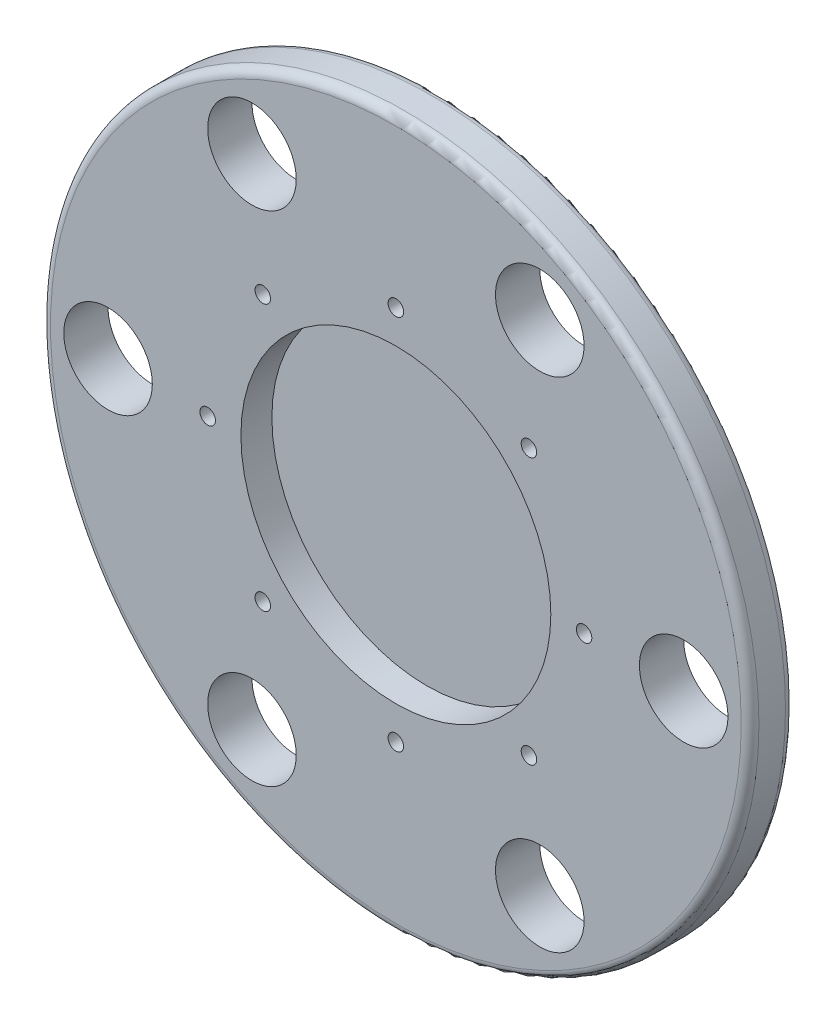
ISO-10303-21;
HEADER;
FILE_DESCRIPTION(('STEP AP214'),'2;1');
FILE_NAME('part.step','',(''),(''),'','','');
FILE_SCHEMA(('AUTOMOTIVE_DESIGN { 1 0 10303 214 1 1 1 1 }'));
ENDSEC;
DATA;
#1=APPLICATION_CONTEXT('core data for automotive mechanical design processes');
#2=APPLICATION_PROTOCOL_DEFINITION('international standard','automotive_design',2000,#1);
#3=PRODUCT_CONTEXT('',#1,'mechanical');
#4=PRODUCT('Part','Part','',(#3));
#5=PRODUCT_RELATED_PRODUCT_CATEGORY('part','',(#4));
#6=PRODUCT_DEFINITION_FORMATION('','',#4);
#7=PRODUCT_DEFINITION_CONTEXT('part definition',#1,'design');
#8=PRODUCT_DEFINITION('design','',#6,#7);
#9=PRODUCT_DEFINITION_SHAPE('','',#8);
#10=(LENGTH_UNIT() NAMED_UNIT(*) SI_UNIT(.MILLI.,.METRE.));
#11=(NAMED_UNIT(*) PLANE_ANGLE_UNIT() SI_UNIT($,.RADIAN.));
#12=(NAMED_UNIT(*) SI_UNIT($,.STERADIAN.) SOLID_ANGLE_UNIT());
#13=UNCERTAINTY_MEASURE_WITH_UNIT(LENGTH_MEASURE(1.E-05),#10,'distance_accuracy_value','');
#14=(GEOMETRIC_REPRESENTATION_CONTEXT(3) GLOBAL_UNCERTAINTY_ASSIGNED_CONTEXT((#13)) GLOBAL_UNIT_ASSIGNED_CONTEXT((#10,
#11,#12)) REPRESENTATION_CONTEXT('',''));
#15=CARTESIAN_POINT('',(0.,0.,0.));
#16=DIRECTION('',(0.,0.,1.));
#17=DIRECTION('',(1.,0.,0.));
#18=AXIS2_PLACEMENT_3D('',#15,#16,#17);
#19=CARTESIAN_POINT('',(0.,0.,-10.));
#20=DIRECTION('',(0.,0.,1.));
#21=DIRECTION('',(1.,0.,0.));
#22=AXIS2_PLACEMENT_3D('',#19,#20,#21);
#23=CYLINDRICAL_SURFACE('',#22,80.);
#24=CARTESIAN_POINT('',(0.,0.,-8.));
#25=DIRECTION('',(0.,0.,1.));
#26=DIRECTION('',(1.,0.,0.));
#27=AXIS2_PLACEMENT_3D('',#24,#25,#26);
#28=CIRCLE('',#27,80.);
#29=CARTESIAN_POINT('',(80.,0.,-8.));
#30=VERTEX_POINT('',#29);
#31=EDGE_CURVE('E53',#30,#30,#28,.T.);
#32=ORIENTED_EDGE('',*,*,#31,.T.);
#33=EDGE_LOOP('',(#32));
#34=FACE_BOUND('',#33,.T.);
#35=CARTESIAN_POINT('',(0.,0.,-2.));
#36=DIRECTION('',(0.,0.,1.));
#37=DIRECTION('',(1.,0.,0.));
#38=AXIS2_PLACEMENT_3D('',#35,#36,#37);
#39=CIRCLE('',#38,80.);
#40=CARTESIAN_POINT('',(80.,0.,-2.));
#41=VERTEX_POINT('',#40);
#42=EDGE_CURVE('E58',#41,#41,#39,.F.);
#43=ORIENTED_EDGE('',*,*,#42,.T.);
#44=EDGE_LOOP('',(#43));
#45=FACE_BOUND('',#44,.T.);
#46=ADVANCED_FACE('F40',(#34,#45),#23,.T.);
#47=CARTESIAN_POINT('',(0.,0.,-10.));
#48=DIRECTION('',(0.,0.,1.));
#49=DIRECTION('',(1.,0.,0.));
#50=AXIS2_PLACEMENT_3D('',#47,#48,#49);
#51=PLANE('',#50);
#52=CARTESIAN_POINT('',(0.,0.,-10.));
#53=DIRECTION('',(0.,0.,1.));
#54=DIRECTION('',(1.,0.,0.));
#55=AXIS2_PLACEMENT_3D('',#52,#53,#54);
#56=CIRCLE('',#55,78.);
#57=CARTESIAN_POINT('',(78.,0.,-10.));
#58=VERTEX_POINT('',#57);
#59=EDGE_CURVE('E48',#58,#58,#56,.F.);
#60=ORIENTED_EDGE('',*,*,#59,.T.);
#61=EDGE_LOOP('',(#60));
#62=FACE_BOUND('',#61,.T.);
#63=CARTESIAN_POINT('',(-42.5,0.,-10.));
#64=DIRECTION('',(0.,0.,1.));
#65=DIRECTION('',(1.,0.,0.));
#66=AXIS2_PLACEMENT_3D('',#63,#64,#65);
#67=CIRCLE('',#66,1.75);
#68=CARTESIAN_POINT('',(-40.75,0.,-10.));
#69=VERTEX_POINT('',#68);
#70=EDGE_CURVE('E111',#69,#69,#67,.T.);
#71=ORIENTED_EDGE('',*,*,#70,.T.);
#72=EDGE_LOOP('',(#71));
#73=FACE_BOUND('',#72,.T.);
#74=CARTESIAN_POINT('',(-30.0520382004282,30.0520382004283,-10.));
#75=DIRECTION('',(0.,0.,1.));
#76=DIRECTION('',(1.,0.,0.));
#77=AXIS2_PLACEMENT_3D('',#74,#75,#76);
#78=CIRCLE('',#77,1.75);
#79=CARTESIAN_POINT('',(-28.3020382004282,30.0520382004283,-10.));
#80=VERTEX_POINT('',#79);
#81=EDGE_CURVE('E169',#80,#80,#78,.T.);
#82=ORIENTED_EDGE('',*,*,#81,.T.);
#83=EDGE_LOOP('',(#82));
#84=FACE_BOUND('',#83,.T.);
#85=CARTESIAN_POINT('',(1.48387956900833E-13,42.5,-10.));
#86=DIRECTION('',(0.,0.,1.));
#87=DIRECTION('',(1.,0.,0.));
#88=AXIS2_PLACEMENT_3D('',#85,#86,#87);
#89=CIRCLE('',#88,1.75);
#90=CARTESIAN_POINT('',(1.75000000000015,42.5,-10.));
#91=VERTEX_POINT('',#90);
#92=EDGE_CURVE('E161',#91,#91,#89,.T.);
#93=ORIENTED_EDGE('',*,*,#92,.T.);
#94=EDGE_LOOP('',(#93));
#95=FACE_BOUND('',#94,.T.);
#96=CARTESIAN_POINT('',(30.0520382004284,30.0520382004281,-10.));
#97=DIRECTION('',(0.,0.,1.));
#98=DIRECTION('',(1.,0.,0.));
#99=AXIS2_PLACEMENT_3D('',#96,#97,#98);
#100=CIRCLE('',#99,1.75);
#101=CARTESIAN_POINT('',(31.8020382004284,30.0520382004281,-10.));
#102=VERTEX_POINT('',#101);
#103=EDGE_CURVE('E153',#102,#102,#100,.T.);
#104=ORIENTED_EDGE('',*,*,#103,.T.);
#105=EDGE_LOOP('',(#104));
#106=FACE_BOUND('',#105,.T.);
#107=CARTESIAN_POINT('',(42.5,-2.96775913801666E-13,-10.));
#108=DIRECTION('',(0.,0.,1.));
#109=DIRECTION('',(1.,0.,0.));
#110=AXIS2_PLACEMENT_3D('',#107,#108,#109);
#111=CIRCLE('',#110,1.75000000000001);
#112=CARTESIAN_POINT('',(44.25,-2.96775913801666E-13,-10.));
#113=VERTEX_POINT('',#112);
#114=EDGE_CURVE('E145',#113,#113,#111,.T.);
#115=ORIENTED_EDGE('',*,*,#114,.T.);
#116=EDGE_LOOP('',(#115));
#117=FACE_BOUND('',#116,.T.);
#118=CARTESIAN_POINT('',(30.052038200428,-30.0520382004285,-10.));
#119=DIRECTION('',(0.,0.,1.));
#120=DIRECTION('',(1.,0.,0.));
#121=AXIS2_PLACEMENT_3D('',#118,#119,#120);
#122=CIRCLE('',#121,1.75);
#123=CARTESIAN_POINT('',(31.802038200428,-30.0520382004285,-10.));
#124=VERTEX_POINT('',#123);
#125=EDGE_CURVE('E137',#124,#124,#122,.T.);
#126=ORIENTED_EDGE('',*,*,#125,.T.);
#127=EDGE_LOOP('',(#126));
#128=FACE_BOUND('',#127,.T.);
#129=CARTESIAN_POINT('',(-4.451638707025E-13,-42.5,-10.));
#130=DIRECTION('',(0.,0.,1.));
#131=DIRECTION('',(1.,0.,0.));
#132=AXIS2_PLACEMENT_3D('',#129,#130,#131);
#133=CIRCLE('',#132,1.75000000000001);
#134=CARTESIAN_POINT('',(1.74999999999956,-42.5,-10.));
#135=VERTEX_POINT('',#134);
#136=EDGE_CURVE('E129',#135,#135,#133,.T.);
#137=ORIENTED_EDGE('',*,*,#136,.T.);
#138=EDGE_LOOP('',(#137));
#139=FACE_BOUND('',#138,.T.);
#140=CARTESIAN_POINT('',(-30.0520382004286,-30.0520382004279,-10.));
#141=DIRECTION('',(0.,0.,1.));
#142=DIRECTION('',(1.,0.,0.));
#143=AXIS2_PLACEMENT_3D('',#140,#141,#142);
#144=CIRCLE('',#143,1.75);
#145=CARTESIAN_POINT('',(-28.3020382004286,-30.0520382004279,-10.));
#146=VERTEX_POINT('',#145);
#147=EDGE_CURVE('E121',#146,#146,#144,.T.);
#148=ORIENTED_EDGE('',*,*,#147,.T.);
#149=EDGE_LOOP('',(#148));
#150=FACE_BOUND('',#149,.T.);
#151=CARTESIAN_POINT('',(-65.,0.,-10.));
#152=DIRECTION('',(0.,0.,1.));
#153=DIRECTION('',(1.,0.,0.));
#154=AXIS2_PLACEMENT_3D('',#151,#152,#153);
#155=CIRCLE('',#154,10.);
#156=CARTESIAN_POINT('',(-55.,0.,-10.));
#157=VERTEX_POINT('',#156);
#158=EDGE_CURVE('E69',#157,#157,#155,.T.);
#159=ORIENTED_EDGE('',*,*,#158,.T.);
#160=EDGE_LOOP('',(#159));
#161=FACE_BOUND('',#160,.T.);
#162=CARTESIAN_POINT('',(-32.4995000000007,-56.2925172713919,-10.));
#163=DIRECTION('',(0.,0.,1.));
#164=DIRECTION('',(1.,0.,0.));
#165=AXIS2_PLACEMENT_3D('',#162,#163,#164);
#166=CIRCLE('',#165,10.);
#167=CARTESIAN_POINT('',(-22.4995000000007,-56.2925172713919,-10.));
#168=VERTEX_POINT('',#167);
#169=EDGE_CURVE('E107',#168,#168,#166,.T.);
#170=ORIENTED_EDGE('',*,*,#169,.T.);
#171=EDGE_LOOP('',(#170));
#172=FACE_BOUND('',#171,.T.);
#173=CARTESIAN_POINT('',(32.5014999999995,-56.2925172713926,-10.));
#174=DIRECTION('',(0.,0.,1.));
#175=DIRECTION('',(1.,0.,0.));
#176=AXIS2_PLACEMENT_3D('',#173,#174,#175);
#177=CIRCLE('',#176,10.);
#178=CARTESIAN_POINT('',(42.5014999999995,-56.2925172713926,-10.));
#179=VERTEX_POINT('',#178);
#180=EDGE_CURVE('E73',#179,#179,#177,.T.);
#181=ORIENTED_EDGE('',*,*,#180,.T.);
#182=EDGE_LOOP('',(#181));
#183=FACE_BOUND('',#182,.T.);
#184=CARTESIAN_POINT('',(65.002,-4.53899557012285E-13,-10.));
#185=DIRECTION('',(0.,0.,1.));
#186=DIRECTION('',(1.,0.,0.));
#187=AXIS2_PLACEMENT_3D('',#184,#185,#186);
#188=CIRCLE('',#187,10.);
#189=CARTESIAN_POINT('',(75.002,-4.53899557012285E-13,-10.));
#190=VERTEX_POINT('',#189);
#191=EDGE_CURVE('E82',#190,#190,#188,.T.);
#192=ORIENTED_EDGE('',*,*,#191,.T.);
#193=EDGE_LOOP('',(#192));
#194=FACE_BOUND('',#193,.T.);
#195=CARTESIAN_POINT('',(32.5015000000003,56.2925172713922,-10.));
#196=DIRECTION('',(0.,0.,1.));
#197=DIRECTION('',(1.,0.,0.));
#198=AXIS2_PLACEMENT_3D('',#195,#196,#197);
#199=CIRCLE('',#198,10.);
#200=CARTESIAN_POINT('',(42.5015000000003,56.2925172713922,-10.));
#201=VERTEX_POINT('',#200);
#202=EDGE_CURVE('E90',#201,#201,#199,.T.);
#203=ORIENTED_EDGE('',*,*,#202,.T.);
#204=EDGE_LOOP('',(#203));
#205=FACE_BOUND('',#204,.T.);
#206=CARTESIAN_POINT('',(-32.4994999999999,56.2925172713924,-10.));
#207=DIRECTION('',(0.,0.,1.));
#208=DIRECTION('',(1.,0.,0.));
#209=AXIS2_PLACEMENT_3D('',#206,#207,#208);
#210=CIRCLE('',#209,10.);
#211=CARTESIAN_POINT('',(-22.4994999999999,56.2925172713924,-10.));
#212=VERTEX_POINT('',#211);
#213=EDGE_CURVE('E98',#212,#212,#210,.T.);
#214=ORIENTED_EDGE('',*,*,#213,.T.);
#215=EDGE_LOOP('',(#214));
#216=FACE_BOUND('',#215,.T.);
#217=ADVANCED_FACE('F185',(#62,#73,#84,#95,#106,#117,#128,#139,#150,#161,#172,#183,#194,#205,
#216),#51,.F.);
#218=CARTESIAN_POINT('',(0.,0.,0.));
#219=DIRECTION('',(0.,0.,1.));
#220=DIRECTION('',(1.,0.,0.));
#221=AXIS2_PLACEMENT_3D('',#218,#219,#220);
#222=PLANE('',#221);
#223=CARTESIAN_POINT('',(0.,0.,0.));
#224=DIRECTION('',(0.,0.,1.));
#225=DIRECTION('',(1.,0.,0.));
#226=AXIS2_PLACEMENT_3D('',#223,#224,#225);
#227=CIRCLE('',#226,78.);
#228=CARTESIAN_POINT('',(78.,0.,0.));
#229=VERTEX_POINT('',#228);
#230=EDGE_CURVE('E10',#229,#229,#227,.T.);
#231=ORIENTED_EDGE('',*,*,#230,.T.);
#232=EDGE_LOOP('',(#231));
#233=FACE_BOUND('',#232,.T.);
#234=CARTESIAN_POINT('',(-42.5,0.,0.));
#235=DIRECTION('',(0.,0.,1.));
#236=DIRECTION('',(1.,0.,0.));
#237=AXIS2_PLACEMENT_3D('',#234,#235,#236);
#238=CIRCLE('',#237,1.75);
#239=CARTESIAN_POINT('',(-40.75,0.,0.));
#240=VERTEX_POINT('',#239);
#241=EDGE_CURVE('E177',#240,#240,#238,.T.);
#242=ORIENTED_EDGE('',*,*,#241,.F.);
#243=EDGE_LOOP('',(#242));
#244=FACE_BOUND('',#243,.T.);
#245=CARTESIAN_POINT('',(-30.0520382004282,30.0520382004283,0.));
#246=DIRECTION('',(0.,0.,1.));
#247=DIRECTION('',(1.,0.,0.));
#248=AXIS2_PLACEMENT_3D('',#245,#246,#247);
#249=CIRCLE('',#248,1.75);
#250=CARTESIAN_POINT('',(-28.3020382004282,30.0520382004283,0.));
#251=VERTEX_POINT('',#250);
#252=EDGE_CURVE('E173',#251,#251,#249,.T.);
#253=ORIENTED_EDGE('',*,*,#252,.F.);
#254=EDGE_LOOP('',(#253));
#255=FACE_BOUND('',#254,.T.);
#256=CARTESIAN_POINT('',(1.48387956900833E-13,42.5,0.));
#257=DIRECTION('',(0.,0.,1.));
#258=DIRECTION('',(1.,0.,0.));
#259=AXIS2_PLACEMENT_3D('',#256,#257,#258);
#260=CIRCLE('',#259,1.75);
#261=CARTESIAN_POINT('',(1.75000000000015,42.5,0.));
#262=VERTEX_POINT('',#261);
#263=EDGE_CURVE('E165',#262,#262,#260,.T.);
#264=ORIENTED_EDGE('',*,*,#263,.F.);
#265=EDGE_LOOP('',(#264));
#266=FACE_BOUND('',#265,.T.);
#267=CARTESIAN_POINT('',(30.0520382004284,30.0520382004281,0.));
#268=DIRECTION('',(0.,0.,1.));
#269=DIRECTION('',(1.,0.,0.));
#270=AXIS2_PLACEMENT_3D('',#267,#268,#269);
#271=CIRCLE('',#270,1.75);
#272=CARTESIAN_POINT('',(31.8020382004284,30.0520382004281,0.));
#273=VERTEX_POINT('',#272);
#274=EDGE_CURVE('E157',#273,#273,#271,.T.);
#275=ORIENTED_EDGE('',*,*,#274,.F.);
#276=EDGE_LOOP('',(#275));
#277=FACE_BOUND('',#276,.T.);
#278=CARTESIAN_POINT('',(42.5,-2.96775913801666E-13,0.));
#279=DIRECTION('',(0.,0.,1.));
#280=DIRECTION('',(1.,0.,0.));
#281=AXIS2_PLACEMENT_3D('',#278,#279,#280);
#282=CIRCLE('',#281,1.75000000000001);
#283=CARTESIAN_POINT('',(44.25,-2.96775913801666E-13,0.));
#284=VERTEX_POINT('',#283);
#285=EDGE_CURVE('E149',#284,#284,#282,.T.);
#286=ORIENTED_EDGE('',*,*,#285,.F.);
#287=EDGE_LOOP('',(#286));
#288=FACE_BOUND('',#287,.T.);
#289=CARTESIAN_POINT('',(30.052038200428,-30.0520382004285,0.));
#290=DIRECTION('',(0.,0.,1.));
#291=DIRECTION('',(1.,0.,0.));
#292=AXIS2_PLACEMENT_3D('',#289,#290,#291);
#293=CIRCLE('',#292,1.75);
#294=CARTESIAN_POINT('',(31.802038200428,-30.0520382004285,0.));
#295=VERTEX_POINT('',#294);
#296=EDGE_CURVE('E141',#295,#295,#293,.T.);
#297=ORIENTED_EDGE('',*,*,#296,.F.);
#298=EDGE_LOOP('',(#297));
#299=FACE_BOUND('',#298,.T.);
#300=CARTESIAN_POINT('',(-4.451638707025E-13,-42.5,0.));
#301=DIRECTION('',(0.,0.,1.));
#302=DIRECTION('',(1.,0.,0.));
#303=AXIS2_PLACEMENT_3D('',#300,#301,#302);
#304=CIRCLE('',#303,1.75000000000001);
#305=CARTESIAN_POINT('',(1.74999999999956,-42.5,0.));
#306=VERTEX_POINT('',#305);
#307=EDGE_CURVE('E133',#306,#306,#304,.T.);
#308=ORIENTED_EDGE('',*,*,#307,.F.);
#309=EDGE_LOOP('',(#308));
#310=FACE_BOUND('',#309,.T.);
#311=CARTESIAN_POINT('',(-30.0520382004286,-30.0520382004279,0.));
#312=DIRECTION('',(0.,0.,1.));
#313=DIRECTION('',(1.,0.,0.));
#314=AXIS2_PLACEMENT_3D('',#311,#312,#313);
#315=CIRCLE('',#314,1.75);
#316=CARTESIAN_POINT('',(-28.3020382004286,-30.0520382004279,0.));
#317=VERTEX_POINT('',#316);
#318=EDGE_CURVE('E125',#317,#317,#315,.T.);
#319=ORIENTED_EDGE('',*,*,#318,.F.);
#320=EDGE_LOOP('',(#319));
#321=FACE_BOUND('',#320,.T.);
#322=CARTESIAN_POINT('',(-65.,0.,0.));
#323=DIRECTION('',(0.,0.,1.));
#324=DIRECTION('',(1.,0.,0.));
#325=AXIS2_PLACEMENT_3D('',#322,#323,#324);
#326=CIRCLE('',#325,10.);
#327=CARTESIAN_POINT('',(-55.,0.,0.));
#328=VERTEX_POINT('',#327);
#329=EDGE_CURVE('E106',#328,#328,#326,.T.);
#330=ORIENTED_EDGE('',*,*,#329,.F.);
#331=EDGE_LOOP('',(#330));
#332=FACE_BOUND('',#331,.T.);
#333=CARTESIAN_POINT('',(-32.4995000000007,-56.2925172713919,0.));
#334=DIRECTION('',(0.,0.,1.));
#335=DIRECTION('',(1.,0.,0.));
#336=AXIS2_PLACEMENT_3D('',#333,#334,#335);
#337=CIRCLE('',#336,10.);
#338=CARTESIAN_POINT('',(-22.4995000000007,-56.2925172713919,0.));
#339=VERTEX_POINT('',#338);
#340=EDGE_CURVE('E78',#339,#339,#337,.T.);
#341=ORIENTED_EDGE('',*,*,#340,.F.);
#342=EDGE_LOOP('',(#341));
#343=FACE_BOUND('',#342,.T.);
#344=CARTESIAN_POINT('',(32.5014999999995,-56.2925172713926,0.));
#345=DIRECTION('',(0.,0.,1.));
#346=DIRECTION('',(1.,0.,0.));
#347=AXIS2_PLACEMENT_3D('',#344,#345,#346);
#348=CIRCLE('',#347,10.);
#349=CARTESIAN_POINT('',(42.5014999999995,-56.2925172713926,0.));
#350=VERTEX_POINT('',#349);
#351=EDGE_CURVE('E77',#350,#350,#348,.T.);
#352=ORIENTED_EDGE('',*,*,#351,.F.);
#353=EDGE_LOOP('',(#352));
#354=FACE_BOUND('',#353,.T.);
#355=CARTESIAN_POINT('',(65.002,-4.53899557012285E-13,0.));
#356=DIRECTION('',(0.,0.,1.));
#357=DIRECTION('',(1.,0.,0.));
#358=AXIS2_PLACEMENT_3D('',#355,#356,#357);
#359=CIRCLE('',#358,10.);
#360=CARTESIAN_POINT('',(75.002,-4.53899557012285E-13,0.));
#361=VERTEX_POINT('',#360);
#362=EDGE_CURVE('E86',#361,#361,#359,.T.);
#363=ORIENTED_EDGE('',*,*,#362,.F.);
#364=EDGE_LOOP('',(#363));
#365=FACE_BOUND('',#364,.T.);
#366=CARTESIAN_POINT('',(32.5015000000003,56.2925172713922,0.));
#367=DIRECTION('',(0.,0.,1.));
#368=DIRECTION('',(1.,0.,0.));
#369=AXIS2_PLACEMENT_3D('',#366,#367,#368);
#370=CIRCLE('',#369,10.);
#371=CARTESIAN_POINT('',(42.5015000000003,56.2925172713922,0.));
#372=VERTEX_POINT('',#371);
#373=EDGE_CURVE('E94',#372,#372,#370,.T.);
#374=ORIENTED_EDGE('',*,*,#373,.F.);
#375=EDGE_LOOP('',(#374));
#376=FACE_BOUND('',#375,.T.);
#377=CARTESIAN_POINT('',(-32.4994999999999,56.2925172713924,0.));
#378=DIRECTION('',(0.,0.,1.));
#379=DIRECTION('',(1.,0.,0.));
#380=AXIS2_PLACEMENT_3D('',#377,#378,#379);
#381=CIRCLE('',#380,10.);
#382=CARTESIAN_POINT('',(-22.4994999999999,56.2925172713924,0.));
#383=VERTEX_POINT('',#382);
#384=EDGE_CURVE('E102',#383,#383,#381,.T.);
#385=ORIENTED_EDGE('',*,*,#384,.F.);
#386=EDGE_LOOP('',(#385));
#387=FACE_BOUND('',#386,.T.);
#388=CARTESIAN_POINT('',(0.,0.,0.));
#389=DIRECTION('',(0.,0.,1.));
#390=DIRECTION('',(1.,0.,0.));
#391=AXIS2_PLACEMENT_3D('',#388,#389,#390);
#392=CIRCLE('',#391,35.);
#393=CARTESIAN_POINT('',(35.,0.,0.));
#394=VERTEX_POINT('',#393);
#395=EDGE_CURVE('E65',#394,#394,#392,.T.);
#396=ORIENTED_EDGE('',*,*,#395,.F.);
#397=EDGE_LOOP('',(#396));
#398=FACE_BOUND('',#397,.T.);
#399=ADVANCED_FACE('F196',(#233,#244,#255,#266,#277,#288,#299,#310,#321,#332,#343,#354,#365,
#376,#387,#398),#222,.T.);
#400=CARTESIAN_POINT('',(0.,0.,-7.));
#401=DIRECTION('',(0.,0.,1.));
#402=DIRECTION('',(1.,0.,0.));
#403=AXIS2_PLACEMENT_3D('',#400,#401,#402);
#404=CYLINDRICAL_SURFACE('',#403,35.);
#405=CARTESIAN_POINT('',(0.,0.,-7.));
#406=DIRECTION('',(0.,0.,1.));
#407=DIRECTION('',(1.,0.,0.));
#408=AXIS2_PLACEMENT_3D('',#405,#406,#407);
#409=CIRCLE('',#408,35.);
#410=CARTESIAN_POINT('',(35.,0.,-7.));
#411=VERTEX_POINT('',#410);
#412=EDGE_CURVE('E64',#411,#411,#409,.T.);
#413=ORIENTED_EDGE('',*,*,#412,.F.);
#414=EDGE_LOOP('',(#413));
#415=FACE_BOUND('',#414,.T.);
#416=ORIENTED_EDGE('',*,*,#395,.T.);
#417=EDGE_LOOP('',(#416));
#418=FACE_BOUND('',#417,.T.);
#419=ADVANCED_FACE('F199',(#415,#418),#404,.F.);
#420=CARTESIAN_POINT('',(0.,0.,-7.));
#421=DIRECTION('',(0.,0.,1.));
#422=DIRECTION('',(1.,0.,0.));
#423=AXIS2_PLACEMENT_3D('',#420,#421,#422);
#424=PLANE('',#423);
#425=ORIENTED_EDGE('',*,*,#412,.T.);
#426=EDGE_LOOP('',(#425));
#427=FACE_BOUND('',#426,.T.);
#428=ADVANCED_FACE('F230',(#427),#424,.T.);
#429=CARTESIAN_POINT('',(-32.4994999999999,56.2925172713924,-10.));
#430=DIRECTION('',(0.,0.,1.));
#431=DIRECTION('',(1.,0.,0.));
#432=AXIS2_PLACEMENT_3D('',#429,#430,#431);
#433=CYLINDRICAL_SURFACE('',#432,10.);
#434=ORIENTED_EDGE('',*,*,#213,.F.);
#435=EDGE_LOOP('',(#434));
#436=FACE_BOUND('',#435,.T.);
#437=ORIENTED_EDGE('',*,*,#384,.T.);
#438=EDGE_LOOP('',(#437));
#439=FACE_BOUND('',#438,.T.);
#440=ADVANCED_FACE('F237',(#436,#439),#433,.F.);
#441=CARTESIAN_POINT('',(32.5015000000003,56.2925172713922,-10.));
#442=DIRECTION('',(0.,0.,1.));
#443=DIRECTION('',(1.,0.,0.));
#444=AXIS2_PLACEMENT_3D('',#441,#442,#443);
#445=CYLINDRICAL_SURFACE('',#444,10.);
#446=ORIENTED_EDGE('',*,*,#202,.F.);
#447=EDGE_LOOP('',(#446));
#448=FACE_BOUND('',#447,.T.);
#449=ORIENTED_EDGE('',*,*,#373,.T.);
#450=EDGE_LOOP('',(#449));
#451=FACE_BOUND('',#450,.T.);
#452=ADVANCED_FACE('F310',(#448,#451),#445,.F.);
#453=CARTESIAN_POINT('',(65.002,-4.53899557012285E-13,-10.));
#454=DIRECTION('',(0.,0.,1.));
#455=DIRECTION('',(1.,0.,0.));
#456=AXIS2_PLACEMENT_3D('',#453,#454,#455);
#457=CYLINDRICAL_SURFACE('',#456,10.);
#458=ORIENTED_EDGE('',*,*,#191,.F.);
#459=EDGE_LOOP('',(#458));
#460=FACE_BOUND('',#459,.T.);
#461=ORIENTED_EDGE('',*,*,#362,.T.);
#462=EDGE_LOOP('',(#461));
#463=FACE_BOUND('',#462,.T.);
#464=ADVANCED_FACE('F320',(#460,#463),#457,.F.);
#465=CARTESIAN_POINT('',(32.5014999999995,-56.2925172713926,-10.));
#466=DIRECTION('',(0.,0.,1.));
#467=DIRECTION('',(1.,0.,0.));
#468=AXIS2_PLACEMENT_3D('',#465,#466,#467);
#469=CYLINDRICAL_SURFACE('',#468,10.);
#470=ORIENTED_EDGE('',*,*,#180,.F.);
#471=EDGE_LOOP('',(#470));
#472=FACE_BOUND('',#471,.T.);
#473=ORIENTED_EDGE('',*,*,#351,.T.);
#474=EDGE_LOOP('',(#473));
#475=FACE_BOUND('',#474,.T.);
#476=ADVANCED_FACE('F330',(#472,#475),#469,.F.);
#477=CARTESIAN_POINT('',(-32.4995000000007,-56.2925172713919,-10.));
#478=DIRECTION('',(0.,0.,1.));
#479=DIRECTION('',(1.,0.,0.));
#480=AXIS2_PLACEMENT_3D('',#477,#478,#479);
#481=CYLINDRICAL_SURFACE('',#480,10.);
#482=ORIENTED_EDGE('',*,*,#169,.F.);
#483=EDGE_LOOP('',(#482));
#484=FACE_BOUND('',#483,.T.);
#485=ORIENTED_EDGE('',*,*,#340,.T.);
#486=EDGE_LOOP('',(#485));
#487=FACE_BOUND('',#486,.T.);
#488=ADVANCED_FACE('F340',(#484,#487),#481,.F.);
#489=CARTESIAN_POINT('',(-65.,0.,-10.));
#490=DIRECTION('',(0.,0.,1.));
#491=DIRECTION('',(1.,0.,0.));
#492=AXIS2_PLACEMENT_3D('',#489,#490,#491);
#493=CYLINDRICAL_SURFACE('',#492,10.);
#494=ORIENTED_EDGE('',*,*,#158,.F.);
#495=EDGE_LOOP('',(#494));
#496=FACE_BOUND('',#495,.T.);
#497=ORIENTED_EDGE('',*,*,#329,.T.);
#498=EDGE_LOOP('',(#497));
#499=FACE_BOUND('',#498,.T.);
#500=ADVANCED_FACE('F350',(#496,#499),#493,.F.);
#501=CARTESIAN_POINT('',(-30.0520382004286,-30.0520382004279,-10.));
#502=DIRECTION('',(0.,0.,1.));
#503=DIRECTION('',(1.,0.,0.));
#504=AXIS2_PLACEMENT_3D('',#501,#502,#503);
#505=CYLINDRICAL_SURFACE('',#504,1.75);
#506=ORIENTED_EDGE('',*,*,#147,.F.);
#507=EDGE_LOOP('',(#506));
#508=FACE_BOUND('',#507,.T.);
#509=ORIENTED_EDGE('',*,*,#318,.T.);
#510=EDGE_LOOP('',(#509));
#511=FACE_BOUND('',#510,.T.);
#512=ADVANCED_FACE('F360',(#508,#511),#505,.F.);
#513=CARTESIAN_POINT('',(-4.451638707025E-13,-42.5,-10.));
#514=DIRECTION('',(0.,0.,1.));
#515=DIRECTION('',(1.,0.,0.));
#516=AXIS2_PLACEMENT_3D('',#513,#514,#515);
#517=CYLINDRICAL_SURFACE('',#516,1.75000000000001);
#518=ORIENTED_EDGE('',*,*,#136,.F.);
#519=EDGE_LOOP('',(#518));
#520=FACE_BOUND('',#519,.T.);
#521=ORIENTED_EDGE('',*,*,#307,.T.);
#522=EDGE_LOOP('',(#521));
#523=FACE_BOUND('',#522,.T.);
#524=ADVANCED_FACE('F370',(#520,#523),#517,.F.);
#525=CARTESIAN_POINT('',(30.052038200428,-30.0520382004285,-10.));
#526=DIRECTION('',(0.,0.,1.));
#527=DIRECTION('',(1.,0.,0.));
#528=AXIS2_PLACEMENT_3D('',#525,#526,#527);
#529=CYLINDRICAL_SURFACE('',#528,1.75);
#530=ORIENTED_EDGE('',*,*,#125,.F.);
#531=EDGE_LOOP('',(#530));
#532=FACE_BOUND('',#531,.T.);
#533=ORIENTED_EDGE('',*,*,#296,.T.);
#534=EDGE_LOOP('',(#533));
#535=FACE_BOUND('',#534,.T.);
#536=ADVANCED_FACE('F380',(#532,#535),#529,.F.);
#537=CARTESIAN_POINT('',(42.5,-2.96775913801666E-13,-10.));
#538=DIRECTION('',(0.,0.,1.));
#539=DIRECTION('',(1.,0.,0.));
#540=AXIS2_PLACEMENT_3D('',#537,#538,#539);
#541=CYLINDRICAL_SURFACE('',#540,1.75000000000001);
#542=ORIENTED_EDGE('',*,*,#114,.F.);
#543=EDGE_LOOP('',(#542));
#544=FACE_BOUND('',#543,.T.);
#545=ORIENTED_EDGE('',*,*,#285,.T.);
#546=EDGE_LOOP('',(#545));
#547=FACE_BOUND('',#546,.T.);
#548=ADVANCED_FACE('F390',(#544,#547),#541,.F.);
#549=CARTESIAN_POINT('',(30.0520382004284,30.0520382004281,-10.));
#550=DIRECTION('',(0.,0.,1.));
#551=DIRECTION('',(1.,0.,0.));
#552=AXIS2_PLACEMENT_3D('',#549,#550,#551);
#553=CYLINDRICAL_SURFACE('',#552,1.75);
#554=ORIENTED_EDGE('',*,*,#103,.F.);
#555=EDGE_LOOP('',(#554));
#556=FACE_BOUND('',#555,.T.);
#557=ORIENTED_EDGE('',*,*,#274,.T.);
#558=EDGE_LOOP('',(#557));
#559=FACE_BOUND('',#558,.T.);
#560=ADVANCED_FACE('F400',(#556,#559),#553,.F.);
#561=CARTESIAN_POINT('',(1.48387956900833E-13,42.5,-10.));
#562=DIRECTION('',(0.,0.,1.));
#563=DIRECTION('',(1.,0.,0.));
#564=AXIS2_PLACEMENT_3D('',#561,#562,#563);
#565=CYLINDRICAL_SURFACE('',#564,1.75);
#566=ORIENTED_EDGE('',*,*,#92,.F.);
#567=EDGE_LOOP('',(#566));
#568=FACE_BOUND('',#567,.T.);
#569=ORIENTED_EDGE('',*,*,#263,.T.);
#570=EDGE_LOOP('',(#569));
#571=FACE_BOUND('',#570,.T.);
#572=ADVANCED_FACE('F410',(#568,#571),#565,.F.);
#573=CARTESIAN_POINT('',(-30.0520382004282,30.0520382004283,-10.));
#574=DIRECTION('',(0.,0.,1.));
#575=DIRECTION('',(1.,0.,0.));
#576=AXIS2_PLACEMENT_3D('',#573,#574,#575);
#577=CYLINDRICAL_SURFACE('',#576,1.75);
#578=ORIENTED_EDGE('',*,*,#81,.F.);
#579=EDGE_LOOP('',(#578));
#580=FACE_BOUND('',#579,.T.);
#581=ORIENTED_EDGE('',*,*,#252,.T.);
#582=EDGE_LOOP('',(#581));
#583=FACE_BOUND('',#582,.T.);
#584=ADVANCED_FACE('F192',(#580,#583),#577,.F.);
#585=CARTESIAN_POINT('',(-42.5,0.,-10.));
#586=DIRECTION('',(0.,0.,1.));
#587=DIRECTION('',(1.,0.,0.));
#588=AXIS2_PLACEMENT_3D('',#585,#586,#587);
#589=CYLINDRICAL_SURFACE('',#588,1.75);
#590=ORIENTED_EDGE('',*,*,#70,.F.);
#591=EDGE_LOOP('',(#590));
#592=FACE_BOUND('',#591,.T.);
#593=ORIENTED_EDGE('',*,*,#241,.T.);
#594=EDGE_LOOP('',(#593));
#595=FACE_BOUND('',#594,.T.);
#596=ADVANCED_FACE('F188',(#592,#595),#589,.F.);
#597=CARTESIAN_POINT('',(0.,0.,-8.));
#598=DIRECTION('',(0.,0.,1.));
#599=DIRECTION('',(1.,0.,0.));
#600=AXIS2_PLACEMENT_3D('',#597,#598,#599);
#601=TOROIDAL_SURFACE('',#600,78.,2.);
#602=ORIENTED_EDGE('',*,*,#59,.F.);
#603=EDGE_LOOP('',(#602));
#604=FACE_BOUND('',#603,.T.);
#605=ORIENTED_EDGE('',*,*,#31,.F.);
#606=EDGE_LOOP('',(#605));
#607=FACE_BOUND('',#606,.T.);
#608=ADVANCED_FACE('F191',(#604,#607),#601,.T.);
#609=CARTESIAN_POINT('',(0.,0.,-2.));
#610=DIRECTION('',(0.,0.,1.));
#611=DIRECTION('',(1.,0.,0.));
#612=AXIS2_PLACEMENT_3D('',#609,#610,#611);
#613=TOROIDAL_SURFACE('',#612,78.,2.);
#614=ORIENTED_EDGE('',*,*,#42,.F.);
#615=EDGE_LOOP('',(#614));
#616=FACE_BOUND('',#615,.T.);
#617=ORIENTED_EDGE('',*,*,#230,.F.);
#618=EDGE_LOOP('',(#617));
#619=FACE_BOUND('',#618,.T.);
#620=ADVANCED_FACE('F42',(#616,#619),#613,.T.);
#621=CLOSED_SHELL('',(#46,#217,#399,#419,#428,#440,#452,#464,#476,#488,#500,#512,#524,#536,#548,
#560,#572,#584,#596,#608,#620));
#622=MANIFOLD_SOLID_BREP('B2',#621);
#623=ADVANCED_BREP_SHAPE_REPRESENTATION('',(#18,#622),#14);
#624=SHAPE_DEFINITION_REPRESENTATION(#9,#623);
ENDSEC;
END-ISO-10303-21;
